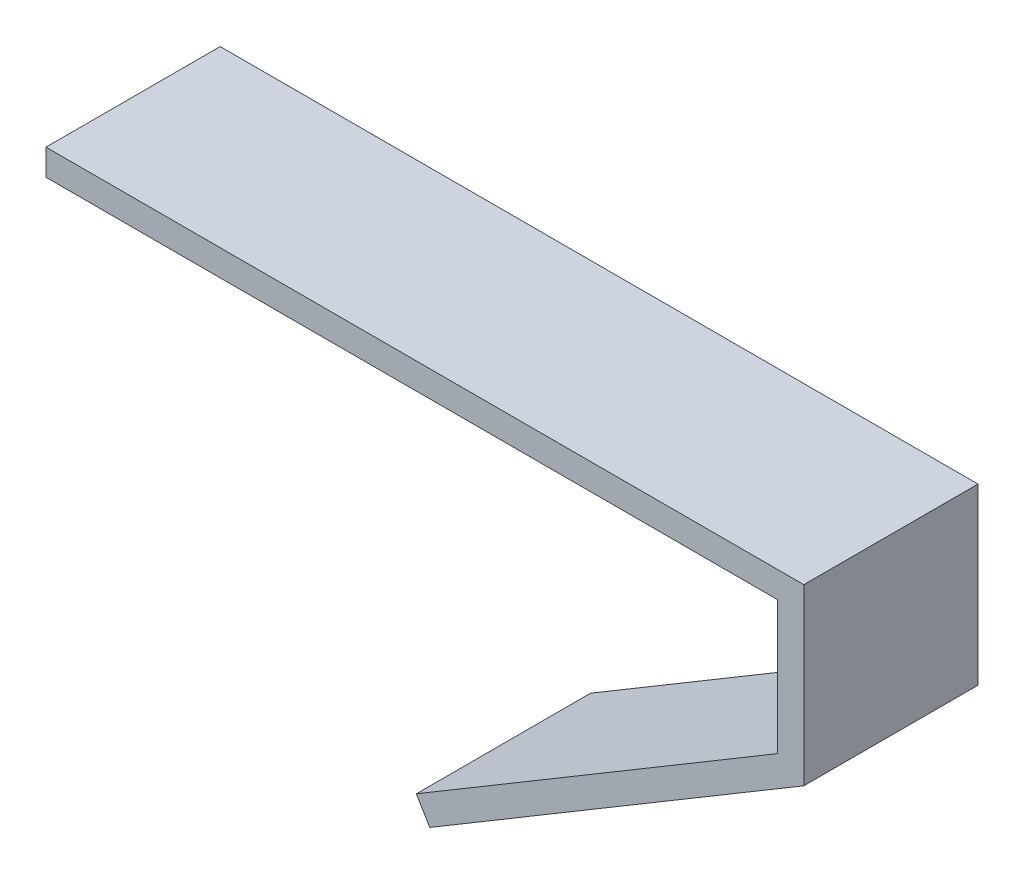
ISO-10303-21;
HEADER;
FILE_DESCRIPTION(('STEP AP214'),'2;1');
FILE_NAME('part.step','',(''),(''),'','','');
FILE_SCHEMA(('AUTOMOTIVE_DESIGN { 1 0 10303 214 1 1 1 1 }'));
ENDSEC;
DATA;
#1=APPLICATION_CONTEXT('core data for automotive mechanical design processes');
#2=APPLICATION_PROTOCOL_DEFINITION('international standard','automotive_design',2000,#1);
#3=PRODUCT_CONTEXT('',#1,'mechanical');
#4=PRODUCT('Part','Part','',(#3));
#5=PRODUCT_RELATED_PRODUCT_CATEGORY('part','',(#4));
#6=PRODUCT_DEFINITION_FORMATION('','',#4);
#7=PRODUCT_DEFINITION_CONTEXT('part definition',#1,'design');
#8=PRODUCT_DEFINITION('design','',#6,#7);
#9=PRODUCT_DEFINITION_SHAPE('','',#8);
#10=(LENGTH_UNIT() NAMED_UNIT(*) SI_UNIT(.MILLI.,.METRE.));
#11=(NAMED_UNIT(*) PLANE_ANGLE_UNIT() SI_UNIT($,.RADIAN.));
#12=(NAMED_UNIT(*) SI_UNIT($,.STERADIAN.) SOLID_ANGLE_UNIT());
#13=UNCERTAINTY_MEASURE_WITH_UNIT(LENGTH_MEASURE(1.E-05),#10,'distance_accuracy_value','');
#14=(GEOMETRIC_REPRESENTATION_CONTEXT(3) GLOBAL_UNCERTAINTY_ASSIGNED_CONTEXT((#13)) GLOBAL_UNIT_ASSIGNED_CONTEXT((#10,
#11,#12)) REPRESENTATION_CONTEXT('',''));
#15=CARTESIAN_POINT('',(0.,0.,0.));
#16=DIRECTION('',(0.,0.,1.));
#17=DIRECTION('',(1.,0.,0.));
#18=AXIS2_PLACEMENT_3D('',#15,#16,#17);
#19=CARTESIAN_POINT('',(95.6153990924213,5.81892475948136,8.03470376394831));
#20=DIRECTION('',(-1.,0.,0.));
#21=DIRECTION('',(0.,0.,1.));
#22=AXIS2_PLACEMENT_3D('',#19,#20,#21);
#23=PLANE('',#22);
#24=DIRECTION('',(0.,-1.,0.));
#25=VECTOR('',#24,1.);
#26=CARTESIAN_POINT('',(95.6153990924213,5.81892475948136,28.0347037639483));
#27=LINE('',#26,#25);
#28=CARTESIAN_POINT('',(95.6153990924213,22.8189247594814,28.0347037639483));
#29=VERTEX_POINT('',#28);
#30=CARTESIAN_POINT('',(95.6153990924213,7.52281568600699,28.0347037639483));
#31=VERTEX_POINT('',#30);
#32=EDGE_CURVE('E50',#29,#31,#27,.T.);
#33=ORIENTED_EDGE('',*,*,#32,.F.);
#34=DIRECTION('',(0.,0.,1.));
#35=VECTOR('',#34,1.);
#36=CARTESIAN_POINT('',(95.6153990924213,22.8189247594814,8.03470376394831));
#37=LINE('',#36,#35);
#38=CARTESIAN_POINT('',(95.6153990924213,22.8189247594814,8.03470376394831));
#39=VERTEX_POINT('',#38);
#40=EDGE_CURVE('E121',#39,#29,#37,.T.);
#41=ORIENTED_EDGE('',*,*,#40,.F.);
#42=DIRECTION('',(0.,-1.,0.));
#43=VECTOR('',#42,1.);
#44=CARTESIAN_POINT('',(95.6153990924213,5.81892475948136,8.03470376394831));
#45=LINE('',#44,#43);
#46=CARTESIAN_POINT('',(95.6153990924213,7.52281568600699,8.03470376394831));
#47=VERTEX_POINT('',#46);
#48=EDGE_CURVE('E58',#39,#47,#45,.T.);
#49=ORIENTED_EDGE('',*,*,#48,.T.);
#50=DIRECTION('',(0.,0.,-1.));
#51=VECTOR('',#50,1.);
#52=CARTESIAN_POINT('',(95.6153990924213,7.522815686007,0.));
#53=LINE('',#52,#51);
#54=EDGE_CURVE('E11',#31,#47,#53,.T.);
#55=ORIENTED_EDGE('',*,*,#54,.F.);
#56=EDGE_LOOP('',(#33,#41,#49,#55));
#57=FACE_BOUND('',#56,.T.);
#58=ADVANCED_FACE('F35',(#57),#23,.T.);
#59=CARTESIAN_POINT('',(97.0788207708581,8.39553630600949,8.03470376394831));
#60=DIRECTION('',(0.,0.,1.));
#61=DIRECTION('',(1.,0.,0.));
#62=AXIS2_PLACEMENT_3D('',#59,#60,#61);
#63=PLANE('',#62);
#64=DIRECTION('',(0.,1.,0.));
#65=VECTOR('',#64,1.);
#66=CARTESIAN_POINT('',(98.6153990924213,5.81892475948136,8.03470376394831));
#67=LINE('',#66,#65);
#68=CARTESIAN_POINT('',(98.6153990924213,5.81892475948136,8.03470376394831));
#69=VERTEX_POINT('',#68);
#70=CARTESIAN_POINT('',(98.6153990924213,25.8189247594814,8.03470376394831));
#71=VERTEX_POINT('',#70);
#72=EDGE_CURVE('E133',#69,#71,#67,.T.);
#73=ORIENTED_EDGE('',*,*,#72,.F.);
#74=DIRECTION('',(-0.858870515509377,-0.512192773854393,0.));
#75=VECTOR('',#74,1.);
#76=CARTESIAN_POINT('',(98.6153990924213,5.81892475948136,8.03470376394831));
#77=LINE('',#76,#75);
#78=CARTESIAN_POINT('',(55.6718733169524,-19.7907139332383,8.03470376394831));
#79=VERTEX_POINT('',#78);
#80=EDGE_CURVE('E143',#69,#79,#77,.T.);
#81=ORIENTED_EDGE('',*,*,#80,.T.);
#82=DIRECTION('',(0.512192773854393,-0.858870515509377,0.));
#83=VECTOR('',#82,1.);
#84=CARTESIAN_POINT('',(54.1352949953892,-17.2141023867102,8.03470376394831));
#85=LINE('',#84,#83);
#86=CARTESIAN_POINT('',(54.1352949953892,-17.2141023867102,8.03470376394831));
#87=VERTEX_POINT('',#86);
#88=EDGE_CURVE('E43',#87,#79,#85,.T.);
#89=ORIENTED_EDGE('',*,*,#88,.F.);
#90=DIRECTION('',(-0.858870515509377,-0.512192773854393,0.));
#91=VECTOR('',#90,1.);
#92=CARTESIAN_POINT('',(97.0788207708581,8.39553630600949,8.03470376394831));
#93=LINE('',#92,#91);
#94=EDGE_CURVE('E144',#47,#87,#93,.T.);
#95=ORIENTED_EDGE('',*,*,#94,.F.);
#96=ORIENTED_EDGE('',*,*,#48,.F.);
#97=DIRECTION('',(1.,0.,0.));
#98=VECTOR('',#97,1.);
#99=CARTESIAN_POINT('',(11.6153990924212,22.8189247594814,8.03470376394831));
#100=LINE('',#99,#98);
#101=CARTESIAN_POINT('',(11.6153990924212,22.8189247594814,8.03470376394831));
#102=VERTEX_POINT('',#101);
#103=EDGE_CURVE('E106',#102,#39,#100,.T.);
#104=ORIENTED_EDGE('',*,*,#103,.F.);
#105=DIRECTION('',(0.,-1.,0.));
#106=VECTOR('',#105,1.);
#107=CARTESIAN_POINT('',(11.6153990924212,25.8189247594814,8.03470376394831));
#108=LINE('',#107,#106);
#109=CARTESIAN_POINT('',(11.6153990924212,25.8189247594814,8.03470376394831));
#110=VERTEX_POINT('',#109);
#111=EDGE_CURVE('E112',#110,#102,#108,.T.);
#112=ORIENTED_EDGE('',*,*,#111,.F.);
#113=DIRECTION('',(-1.,0.,0.));
#114=VECTOR('',#113,1.);
#115=CARTESIAN_POINT('',(98.6153990924213,25.8189247594814,8.03470376394831));
#116=LINE('',#115,#114);
#117=EDGE_CURVE('E136',#71,#110,#116,.T.);
#118=ORIENTED_EDGE('',*,*,#117,.F.);
#119=EDGE_LOOP('',(#73,#81,#89,#95,#96,#104,#112,#118));
#120=FACE_BOUND('',#119,.T.);
#121=ADVANCED_FACE('F37',(#120),#63,.F.);
#122=CARTESIAN_POINT('',(54.1352949953892,-17.2141023867102,28.0347037639483));
#123=DIRECTION('',(0.858870515509377,0.512192773854393,0.));
#124=DIRECTION('',(-0.512192773854393,0.858870515509377,0.));
#125=AXIS2_PLACEMENT_3D('',#122,#123,#124);
#126=PLANE('',#125);
#127=DIRECTION('',(0.,0.,1.));
#128=VECTOR('',#127,1.);
#129=CARTESIAN_POINT('',(55.6718733169524,-19.7907139332383,28.0347037639483));
#130=LINE('',#129,#128);
#131=CARTESIAN_POINT('',(55.6718733169524,-19.7907139332383,28.0347037639483));
#132=VERTEX_POINT('',#131);
#133=EDGE_CURVE('E154',#79,#132,#130,.T.);
#134=ORIENTED_EDGE('',*,*,#133,.T.);
#135=DIRECTION('',(0.512192773854393,-0.858870515509377,0.));
#136=VECTOR('',#135,1.);
#137=CARTESIAN_POINT('',(54.1352949953892,-17.2141023867102,28.0347037639483));
#138=LINE('',#137,#136);
#139=CARTESIAN_POINT('',(54.1352949953892,-17.2141023867102,28.0347037639483));
#140=VERTEX_POINT('',#139);
#141=EDGE_CURVE('E151',#140,#132,#138,.T.);
#142=ORIENTED_EDGE('',*,*,#141,.F.);
#143=DIRECTION('',(0.,0.,1.));
#144=VECTOR('',#143,1.);
#145=CARTESIAN_POINT('',(54.1352949953892,-17.2141023867102,28.0347037639483));
#146=LINE('',#145,#144);
#147=EDGE_CURVE('E146',#87,#140,#146,.T.);
#148=ORIENTED_EDGE('',*,*,#147,.F.);
#149=ORIENTED_EDGE('',*,*,#88,.T.);
#150=EDGE_LOOP('',(#134,#142,#148,#149));
#151=FACE_BOUND('',#150,.T.);
#152=ADVANCED_FACE('F165',(#151),#126,.F.);
#153=CARTESIAN_POINT('',(97.0788207708581,8.39553630600949,28.0347037639483));
#154=DIRECTION('',(0.,0.,-1.));
#155=DIRECTION('',(-1.,0.,0.));
#156=AXIS2_PLACEMENT_3D('',#153,#154,#155);
#157=PLANE('',#156);
#158=DIRECTION('',(0.858870515509377,0.512192773854393,0.));
#159=VECTOR('',#158,1.);
#160=CARTESIAN_POINT('',(98.6153990924213,5.81892475948136,28.0347037639483));
#161=LINE('',#160,#159);
#162=CARTESIAN_POINT('',(98.6153990924213,5.81892475948136,28.0347037639483));
#163=VERTEX_POINT('',#162);
#164=EDGE_CURVE('E156',#132,#163,#161,.T.);
#165=ORIENTED_EDGE('',*,*,#164,.T.);
#166=DIRECTION('',(0.,1.,0.));
#167=VECTOR('',#166,1.);
#168=CARTESIAN_POINT('',(98.6153990924213,5.81892475948136,28.0347037639483));
#169=LINE('',#168,#167);
#170=CARTESIAN_POINT('',(98.6153990924213,25.8189247594814,28.0347037639483));
#171=VERTEX_POINT('',#170);
#172=EDGE_CURVE('E125',#163,#171,#169,.T.);
#173=ORIENTED_EDGE('',*,*,#172,.T.);
#174=DIRECTION('',(-1.,0.,0.));
#175=VECTOR('',#174,1.);
#176=CARTESIAN_POINT('',(98.6153990924213,25.8189247594814,28.0347037639483));
#177=LINE('',#176,#175);
#178=CARTESIAN_POINT('',(11.6153990924212,25.8189247594814,28.0347037639483));
#179=VERTEX_POINT('',#178);
#180=EDGE_CURVE('E128',#171,#179,#177,.T.);
#181=ORIENTED_EDGE('',*,*,#180,.T.);
#182=DIRECTION('',(0.,1.,0.));
#183=VECTOR('',#182,1.);
#184=CARTESIAN_POINT('',(11.6153990924212,25.8189247594814,28.0347037639483));
#185=LINE('',#184,#183);
#186=CARTESIAN_POINT('',(11.6153990924212,22.8189247594814,28.0347037639483));
#187=VERTEX_POINT('',#186);
#188=EDGE_CURVE('E111',#187,#179,#185,.T.);
#189=ORIENTED_EDGE('',*,*,#188,.F.);
#190=DIRECTION('',(1.,0.,0.));
#191=VECTOR('',#190,1.);
#192=CARTESIAN_POINT('',(11.6153990924212,22.8189247594814,28.0347037639483));
#193=LINE('',#192,#191);
#194=EDGE_CURVE('E107',#187,#29,#193,.T.);
#195=ORIENTED_EDGE('',*,*,#194,.T.);
#196=ORIENTED_EDGE('',*,*,#32,.T.);
#197=DIRECTION('',(0.858870515509377,0.512192773854393,0.));
#198=VECTOR('',#197,1.);
#199=CARTESIAN_POINT('',(97.0788207708581,8.39553630600949,28.0347037639483));
#200=LINE('',#199,#198);
#201=EDGE_CURVE('E149',#140,#31,#200,.T.);
#202=ORIENTED_EDGE('',*,*,#201,.F.);
#203=ORIENTED_EDGE('',*,*,#141,.T.);
#204=EDGE_LOOP('',(#165,#173,#181,#189,#195,#196,#202,#203));
#205=FACE_BOUND('',#204,.T.);
#206=ADVANCED_FACE('F175',(#205),#157,.F.);
#207=CARTESIAN_POINT('',(21.7745399294315,-36.5126399449884,0.));
#208=DIRECTION('',(0.512192773854393,-0.858870515509377,0.));
#209=DIRECTION('',(0.858870515509377,0.512192773854393,0.));
#210=AXIS2_PLACEMENT_3D('',#207,#208,#209);
#211=PLANE('',#210);
#212=ORIENTED_EDGE('',*,*,#201,.T.);
#213=ORIENTED_EDGE('',*,*,#54,.T.);
#214=ORIENTED_EDGE('',*,*,#94,.T.);
#215=ORIENTED_EDGE('',*,*,#147,.T.);
#216=EDGE_LOOP('',(#212,#213,#214,#215));
#217=FACE_BOUND('',#216,.T.);
#218=ADVANCED_FACE('F177',(#217),#211,.F.);
#219=CARTESIAN_POINT('',(23.3111182509946,-39.0892514915165,0.));
#220=DIRECTION('',(0.512192773854393,-0.858870515509377,0.));
#221=DIRECTION('',(0.858870515509377,0.512192773854393,0.));
#222=AXIS2_PLACEMENT_3D('',#219,#220,#221);
#223=PLANE('',#222);
#224=ORIENTED_EDGE('',*,*,#80,.F.);
#225=DIRECTION('',(0.,0.,-1.));
#226=VECTOR('',#225,1.);
#227=CARTESIAN_POINT('',(98.6153990924213,5.81892475948136,28.0347037639483));
#228=LINE('',#227,#226);
#229=EDGE_CURVE('E147',#163,#69,#228,.T.);
#230=ORIENTED_EDGE('',*,*,#229,.F.);
#231=ORIENTED_EDGE('',*,*,#164,.F.);
#232=ORIENTED_EDGE('',*,*,#133,.F.);
#233=EDGE_LOOP('',(#224,#230,#231,#232));
#234=FACE_BOUND('',#233,.T.);
#235=ADVANCED_FACE('F169',(#234),#223,.T.);
#236=CARTESIAN_POINT('',(98.6153990924213,5.81892475948136,8.03470376394831));
#237=DIRECTION('',(1.,0.,0.));
#238=DIRECTION('',(0.,0.,-1.));
#239=AXIS2_PLACEMENT_3D('',#236,#237,#238);
#240=PLANE('',#239);
#241=ORIENTED_EDGE('',*,*,#172,.F.);
#242=ORIENTED_EDGE('',*,*,#229,.T.);
#243=ORIENTED_EDGE('',*,*,#72,.T.);
#244=DIRECTION('',(0.,0.,1.));
#245=VECTOR('',#244,1.);
#246=CARTESIAN_POINT('',(98.6153990924213,25.8189247594814,8.03470376394831));
#247=LINE('',#246,#245);
#248=EDGE_CURVE('E138',#71,#171,#247,.T.);
#249=ORIENTED_EDGE('',*,*,#248,.T.);
#250=EDGE_LOOP('',(#241,#242,#243,#249));
#251=FACE_BOUND('',#250,.T.);
#252=ADVANCED_FACE('F173',(#251),#240,.T.);
#253=CARTESIAN_POINT('',(98.6153990924213,25.8189247594814,8.03470376394831));
#254=DIRECTION('',(0.,1.,0.));
#255=DIRECTION('',(0.,0.,1.));
#256=AXIS2_PLACEMENT_3D('',#253,#254,#255);
#257=PLANE('',#256);
#258=ORIENTED_EDGE('',*,*,#180,.F.);
#259=ORIENTED_EDGE('',*,*,#248,.F.);
#260=ORIENTED_EDGE('',*,*,#117,.T.);
#261=DIRECTION('',(0.,0.,-1.));
#262=VECTOR('',#261,1.);
#263=CARTESIAN_POINT('',(11.6153990924212,25.8189247594814,8.03470376394831));
#264=LINE('',#263,#262);
#265=EDGE_CURVE('E118',#179,#110,#264,.T.);
#266=ORIENTED_EDGE('',*,*,#265,.F.);
#267=EDGE_LOOP('',(#258,#259,#260,#266));
#268=FACE_BOUND('',#267,.T.);
#269=ADVANCED_FACE('F181',(#268),#257,.T.);
#270=CARTESIAN_POINT('',(11.6153990924212,22.8189247594814,8.03470376394831));
#271=DIRECTION('',(0.,1.,0.));
#272=DIRECTION('',(0.,0.,1.));
#273=AXIS2_PLACEMENT_3D('',#270,#271,#272);
#274=PLANE('',#273);
#275=ORIENTED_EDGE('',*,*,#40,.T.);
#276=ORIENTED_EDGE('',*,*,#194,.F.);
#277=DIRECTION('',(0.,0.,1.));
#278=VECTOR('',#277,1.);
#279=CARTESIAN_POINT('',(11.6153990924212,22.8189247594814,8.03470376394831));
#280=LINE('',#279,#278);
#281=EDGE_CURVE('E102',#102,#187,#280,.T.);
#282=ORIENTED_EDGE('',*,*,#281,.F.);
#283=ORIENTED_EDGE('',*,*,#103,.T.);
#284=EDGE_LOOP('',(#275,#276,#282,#283));
#285=FACE_BOUND('',#284,.T.);
#286=ADVANCED_FACE('F104',(#285),#274,.F.);
#287=CARTESIAN_POINT('',(11.6153990924212,0.,0.));
#288=DIRECTION('',(-1.,0.,0.));
#289=DIRECTION('',(0.,0.,1.));
#290=AXIS2_PLACEMENT_3D('',#287,#288,#289);
#291=PLANE('',#290);
#292=ORIENTED_EDGE('',*,*,#111,.T.);
#293=ORIENTED_EDGE('',*,*,#281,.T.);
#294=ORIENTED_EDGE('',*,*,#188,.T.);
#295=ORIENTED_EDGE('',*,*,#265,.T.);
#296=EDGE_LOOP('',(#292,#293,#294,#295));
#297=FACE_BOUND('',#296,.T.);
#298=ADVANCED_FACE('F116',(#297),#291,.T.);
#299=CLOSED_SHELL('',(#58,#121,#152,#206,#218,#235,#252,#269,#286,#298));
#300=MANIFOLD_SOLID_BREP('B2',#299);
#301=ADVANCED_BREP_SHAPE_REPRESENTATION('',(#18,#300),#14);
#302=SHAPE_DEFINITION_REPRESENTATION(#9,#301);
ENDSEC;
END-ISO-10303-21;
